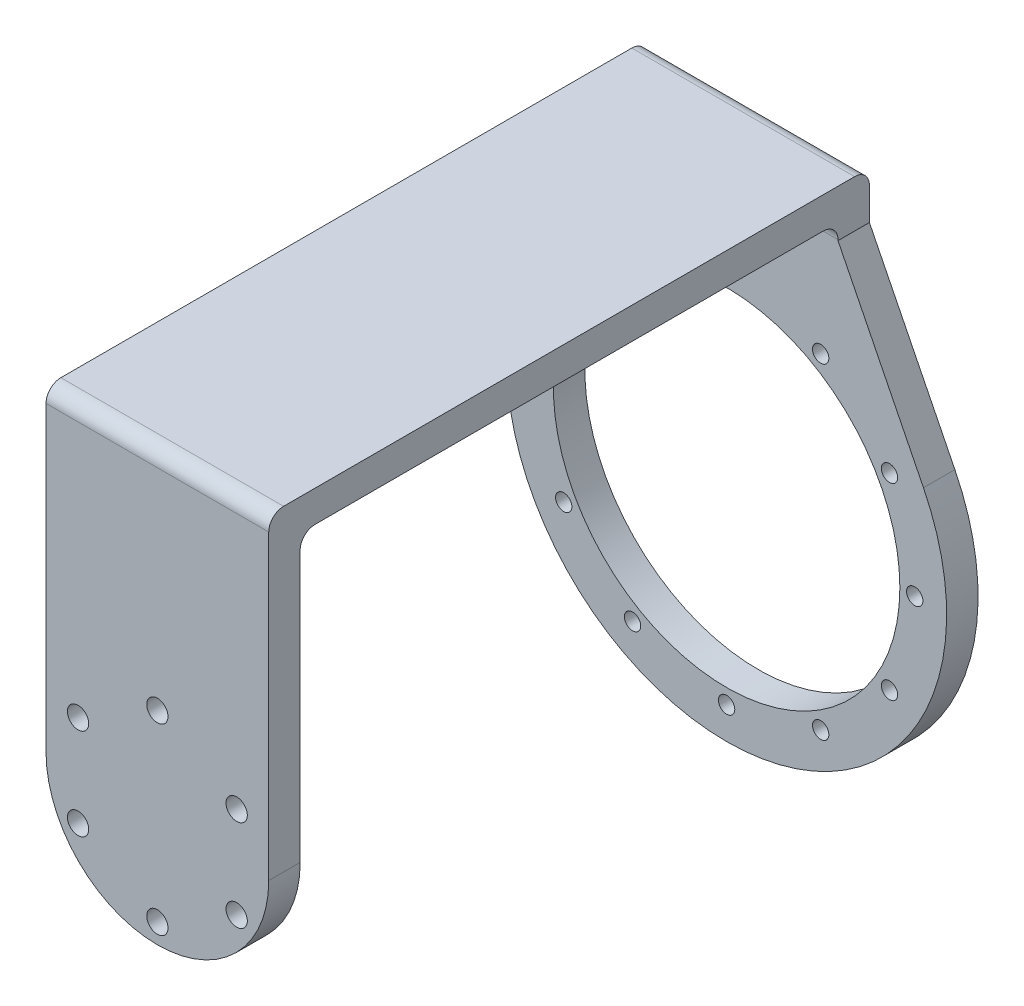
ISO-10303-21;
HEADER;
FILE_DESCRIPTION(('STEP AP214'),'2;1');
FILE_NAME('part.step','',(''),(''),'','','');
FILE_SCHEMA(('AUTOMOTIVE_DESIGN { 1 0 10303 214 1 1 1 1 }'));
ENDSEC;
DATA;
#1=APPLICATION_CONTEXT('core data for automotive mechanical design processes');
#2=APPLICATION_PROTOCOL_DEFINITION('international standard','automotive_design',2000,#1);
#3=PRODUCT_CONTEXT('',#1,'mechanical');
#4=PRODUCT('Part','Part','',(#3));
#5=PRODUCT_RELATED_PRODUCT_CATEGORY('part','',(#4));
#6=PRODUCT_DEFINITION_FORMATION('','',#4);
#7=PRODUCT_DEFINITION_CONTEXT('part definition',#1,'design');
#8=PRODUCT_DEFINITION('design','',#6,#7);
#9=PRODUCT_DEFINITION_SHAPE('','',#8);
#10=(LENGTH_UNIT() NAMED_UNIT(*) SI_UNIT(.MILLI.,.METRE.));
#11=(NAMED_UNIT(*) PLANE_ANGLE_UNIT() SI_UNIT($,.RADIAN.));
#12=(NAMED_UNIT(*) SI_UNIT($,.STERADIAN.) SOLID_ANGLE_UNIT());
#13=UNCERTAINTY_MEASURE_WITH_UNIT(LENGTH_MEASURE(1.E-05),#10,'distance_accuracy_value','');
#14=(GEOMETRIC_REPRESENTATION_CONTEXT(3) GLOBAL_UNCERTAINTY_ASSIGNED_CONTEXT((#13)) GLOBAL_UNIT_ASSIGNED_CONTEXT((#10,
#11,#12)) REPRESENTATION_CONTEXT('',''));
#15=CARTESIAN_POINT('',(0.,0.,0.));
#16=DIRECTION('',(0.,0.,1.));
#17=DIRECTION('',(1.,0.,0.));
#18=AXIS2_PLACEMENT_3D('',#15,#16,#17);
#19=CARTESIAN_POINT('',(0.,0.,6.35));
#20=DIRECTION('',(0.,0.,-1.));
#21=DIRECTION('',(-1.,0.,0.));
#22=AXIS2_PLACEMENT_3D('',#19,#20,#21);
#23=CYLINDRICAL_SURFACE('',#22,35.);
#24=CARTESIAN_POINT('',(0.,0.,6.35));
#25=DIRECTION('',(0.,0.,1.));
#26=DIRECTION('',(1.,0.,0.));
#27=AXIS2_PLACEMENT_3D('',#24,#25,#26);
#28=CIRCLE('',#27,35.);
#29=CARTESIAN_POINT('',(35.,0.,6.35));
#30=VERTEX_POINT('',#29);
#31=EDGE_CURVE('E51',#30,#30,#28,.T.);
#32=ORIENTED_EDGE('',*,*,#31,.T.);
#33=EDGE_LOOP('',(#32));
#34=FACE_BOUND('',#33,.T.);
#35=CARTESIAN_POINT('',(0.,0.,0.));
#36=DIRECTION('',(0.,0.,1.));
#37=DIRECTION('',(1.,0.,0.));
#38=AXIS2_PLACEMENT_3D('',#35,#36,#37);
#39=CIRCLE('',#38,35.);
#40=CARTESIAN_POINT('',(35.,0.,0.));
#41=VERTEX_POINT('',#40);
#42=EDGE_CURVE('E361',#41,#41,#39,.T.);
#43=ORIENTED_EDGE('',*,*,#42,.F.);
#44=EDGE_LOOP('',(#43));
#45=FACE_BOUND('',#44,.T.);
#46=ADVANCED_FACE('F43',(#34,#45),#23,.F.);
#47=CARTESIAN_POINT('',(0.,0.,6.35));
#48=DIRECTION('',(0.,0.,-1.));
#49=DIRECTION('',(-1.,0.,0.));
#50=AXIS2_PLACEMENT_3D('',#47,#48,#49);
#51=CYLINDRICAL_SURFACE('',#50,44.45);
#52=CARTESIAN_POINT('',(0.,0.,6.35));
#53=DIRECTION('',(0.,0.,1.));
#54=DIRECTION('',(1.,0.,0.));
#55=AXIS2_PLACEMENT_3D('',#52,#53,#54);
#56=CIRCLE('',#55,44.45);
#57=CARTESIAN_POINT('',(-39.770338523173,19.8525231079634,6.35));
#58=VERTEX_POINT('',#57);
#59=CARTESIAN_POINT('',(39.770338523173,19.8525231079634,6.35));
#60=VERTEX_POINT('',#59);
#61=EDGE_CURVE('E11',#58,#60,#56,.T.);
#62=ORIENTED_EDGE('',*,*,#61,.F.);
#63=DIRECTION('',(0.,0.,-1.));
#64=VECTOR('',#63,1.);
#65=CARTESIAN_POINT('',(-39.770338523173,19.8525231079634,6.35));
#66=LINE('',#65,#64);
#67=CARTESIAN_POINT('',(-39.770338523173,19.8525231079634,0.));
#68=VERTEX_POINT('',#67);
#69=EDGE_CURVE('E281',#58,#68,#66,.T.);
#70=ORIENTED_EDGE('',*,*,#69,.T.);
#71=CARTESIAN_POINT('',(0.,0.,0.));
#72=DIRECTION('',(0.,0.,1.));
#73=DIRECTION('',(1.,0.,0.));
#74=AXIS2_PLACEMENT_3D('',#71,#72,#73);
#75=CIRCLE('',#74,44.45);
#76=CARTESIAN_POINT('',(39.770338523173,19.8525231079634,0.));
#77=VERTEX_POINT('',#76);
#78=EDGE_CURVE('E46',#68,#77,#75,.T.);
#79=ORIENTED_EDGE('',*,*,#78,.T.);
#80=DIRECTION('',(0.,0.,-1.));
#81=VECTOR('',#80,1.);
#82=CARTESIAN_POINT('',(39.770338523173,19.8525231079634,6.35));
#83=LINE('',#82,#81);
#84=EDGE_CURVE('E62',#60,#77,#83,.T.);
#85=ORIENTED_EDGE('',*,*,#84,.F.);
#86=EDGE_LOOP('',(#62,#70,#79,#85));
#87=FACE_BOUND('',#86,.T.);
#88=ADVANCED_FACE('F366',(#87),#51,.T.);
#89=CARTESIAN_POINT('',(0.,0.,6.35));
#90=DIRECTION('',(0.,0.,1.));
#91=DIRECTION('',(1.,0.,0.));
#92=AXIS2_PLACEMENT_3D('',#89,#90,#91);
#93=PLANE('',#92);
#94=CARTESIAN_POINT('',(18.9999999999996,32.9089653438089,6.35));
#95=DIRECTION('',(0.,0.,1.));
#96=DIRECTION('',(1.,0.,0.));
#97=AXIS2_PLACEMENT_3D('',#94,#95,#96);
#98=CIRCLE('',#97,1.64999999999999);
#99=CARTESIAN_POINT('',(20.6499999999996,32.9089653438089,6.35));
#100=VERTEX_POINT('',#99);
#101=EDGE_CURVE('E283',#100,#100,#98,.T.);
#102=ORIENTED_EDGE('',*,*,#101,.F.);
#103=EDGE_LOOP('',(#102));
#104=FACE_BOUND('',#103,.T.);
#105=CARTESIAN_POINT('',(32.9089653438084,19.0000000000004,6.35));
#106=DIRECTION('',(0.,0.,1.));
#107=DIRECTION('',(1.,0.,0.));
#108=AXIS2_PLACEMENT_3D('',#105,#106,#107);
#109=CIRCLE('',#108,1.64999999999998);
#110=CARTESIAN_POINT('',(34.5589653438084,19.0000000000004,6.35));
#111=VERTEX_POINT('',#110);
#112=EDGE_CURVE('E295',#111,#111,#109,.T.);
#113=ORIENTED_EDGE('',*,*,#112,.F.);
#114=EDGE_LOOP('',(#113));
#115=FACE_BOUND('',#114,.T.);
#116=CARTESIAN_POINT('',(38.,3.98028872628117E-13,6.35));
#117=DIRECTION('',(0.,0.,1.));
#118=DIRECTION('',(1.,0.,0.));
#119=AXIS2_PLACEMENT_3D('',#116,#117,#118);
#120=CIRCLE('',#119,1.64999999999998);
#121=CARTESIAN_POINT('',(39.65,3.98028872628117E-13,6.35));
#122=VERTEX_POINT('',#121);
#123=EDGE_CURVE('E301',#122,#122,#120,.T.);
#124=ORIENTED_EDGE('',*,*,#123,.F.);
#125=EDGE_LOOP('',(#124));
#126=FACE_BOUND('',#125,.T.);
#127=CARTESIAN_POINT('',(32.9089653438088,-18.9999999999997,6.35));
#128=DIRECTION('',(0.,0.,1.));
#129=DIRECTION('',(1.,0.,0.));
#130=AXIS2_PLACEMENT_3D('',#127,#128,#129);
#131=CIRCLE('',#130,1.64999999999999);
#132=CARTESIAN_POINT('',(34.5589653438088,-18.9999999999997,6.35));
#133=VERTEX_POINT('',#132);
#134=EDGE_CURVE('E307',#133,#133,#131,.T.);
#135=ORIENTED_EDGE('',*,*,#134,.F.);
#136=EDGE_LOOP('',(#135));
#137=FACE_BOUND('',#136,.T.);
#138=CARTESIAN_POINT('',(19.0000000000003,-32.9089653438085,6.35));
#139=DIRECTION('',(0.,0.,1.));
#140=DIRECTION('',(1.,0.,0.));
#141=AXIS2_PLACEMENT_3D('',#138,#139,#140);
#142=CIRCLE('',#141,1.64999999999999);
#143=CARTESIAN_POINT('',(20.6500000000003,-32.9089653438085,6.35));
#144=VERTEX_POINT('',#143);
#145=EDGE_CURVE('E313',#144,#144,#142,.T.);
#146=ORIENTED_EDGE('',*,*,#145,.F.);
#147=EDGE_LOOP('',(#146));
#148=FACE_BOUND('',#147,.T.);
#149=CARTESIAN_POINT('',(0.,-38.,6.35));
#150=DIRECTION('',(0.,0.,1.));
#151=DIRECTION('',(1.,0.,0.));
#152=AXIS2_PLACEMENT_3D('',#149,#150,#151);
#153=CIRCLE('',#152,1.64999999999999);
#154=CARTESIAN_POINT('',(1.64999999999999,-38.,6.35));
#155=VERTEX_POINT('',#154);
#156=EDGE_CURVE('E319',#155,#155,#153,.T.);
#157=ORIENTED_EDGE('',*,*,#156,.F.);
#158=EDGE_LOOP('',(#157));
#159=FACE_BOUND('',#158,.T.);
#160=CARTESIAN_POINT('',(-18.9999999999998,-32.9089653438088,6.35));
#161=DIRECTION('',(0.,0.,1.));
#162=DIRECTION('',(1.,0.,0.));
#163=AXIS2_PLACEMENT_3D('',#160,#161,#162);
#164=CIRCLE('',#163,1.64999999999999);
#165=CARTESIAN_POINT('',(-17.3499999999998,-32.9089653438088,6.35));
#166=VERTEX_POINT('',#165);
#167=EDGE_CURVE('E325',#166,#166,#164,.T.);
#168=ORIENTED_EDGE('',*,*,#167,.F.);
#169=EDGE_LOOP('',(#168));
#170=FACE_BOUND('',#169,.T.);
#171=CARTESIAN_POINT('',(-32.9089653438086,-19.0000000000002,6.35));
#172=DIRECTION('',(0.,0.,1.));
#173=DIRECTION('',(1.,0.,0.));
#174=AXIS2_PLACEMENT_3D('',#171,#172,#173);
#175=CIRCLE('',#174,1.64999999999998);
#176=CARTESIAN_POINT('',(-31.2589653438086,-19.0000000000002,6.35));
#177=VERTEX_POINT('',#176);
#178=EDGE_CURVE('E331',#177,#177,#175,.T.);
#179=ORIENTED_EDGE('',*,*,#178,.F.);
#180=EDGE_LOOP('',(#179));
#181=FACE_BOUND('',#180,.T.);
#182=CARTESIAN_POINT('',(-38.,-1.32676290876039E-13,6.35));
#183=DIRECTION('',(0.,0.,1.));
#184=DIRECTION('',(1.,0.,0.));
#185=AXIS2_PLACEMENT_3D('',#182,#183,#184);
#186=CIRCLE('',#185,1.64999999999998);
#187=CARTESIAN_POINT('',(-36.35,-1.32676290876039E-13,6.35));
#188=VERTEX_POINT('',#187);
#189=EDGE_CURVE('E337',#188,#188,#186,.T.);
#190=ORIENTED_EDGE('',*,*,#189,.F.);
#191=EDGE_LOOP('',(#190));
#192=FACE_BOUND('',#191,.T.);
#193=CARTESIAN_POINT('',(-32.9089653438087,18.9999999999999,6.35));
#194=DIRECTION('',(0.,0.,1.));
#195=DIRECTION('',(1.,0.,0.));
#196=AXIS2_PLACEMENT_3D('',#193,#194,#195);
#197=CIRCLE('',#196,1.64999999999999);
#198=CARTESIAN_POINT('',(-31.2589653438087,18.9999999999999,6.35));
#199=VERTEX_POINT('',#198);
#200=EDGE_CURVE('E343',#199,#199,#197,.T.);
#201=ORIENTED_EDGE('',*,*,#200,.F.);
#202=EDGE_LOOP('',(#201));
#203=FACE_BOUND('',#202,.T.);
#204=CARTESIAN_POINT('',(-19.,32.9089653438086,6.35));
#205=DIRECTION('',(0.,0.,1.));
#206=DIRECTION('',(1.,0.,0.));
#207=AXIS2_PLACEMENT_3D('',#204,#205,#206);
#208=CIRCLE('',#207,1.64999999999999);
#209=CARTESIAN_POINT('',(-17.35,32.9089653438086,6.35));
#210=VERTEX_POINT('',#209);
#211=EDGE_CURVE('E349',#210,#210,#208,.T.);
#212=ORIENTED_EDGE('',*,*,#211,.F.);
#213=EDGE_LOOP('',(#212));
#214=FACE_BOUND('',#213,.T.);
#215=CARTESIAN_POINT('',(0.,38.,6.35));
#216=DIRECTION('',(0.,0.,1.));
#217=DIRECTION('',(1.,0.,0.));
#218=AXIS2_PLACEMENT_3D('',#215,#216,#217);
#219=CIRCLE('',#218,1.64999999999999);
#220=CARTESIAN_POINT('',(1.64999999999999,38.,6.35));
#221=VERTEX_POINT('',#220);
#222=EDGE_CURVE('E355',#221,#221,#219,.T.);
#223=ORIENTED_EDGE('',*,*,#222,.F.);
#224=EDGE_LOOP('',(#223));
#225=FACE_BOUND('',#224,.T.);
#226=ORIENTED_EDGE('',*,*,#31,.F.);
#227=EDGE_LOOP('',(#226));
#228=FACE_BOUND('',#227,.T.);
#229=ORIENTED_EDGE('',*,*,#61,.T.);
#230=DIRECTION('',(0.446625941686466,-0.894720776674308,0.));
#231=VECTOR('',#230,1.);
#232=CARTESIAN_POINT('',(22.5,54.45,6.35));
#233=LINE('',#232,#231);
#234=CARTESIAN_POINT('',(22.5,54.45,6.35));
#235=VERTEX_POINT('',#234);
#236=EDGE_CURVE('E272',#235,#60,#233,.T.);
#237=ORIENTED_EDGE('',*,*,#236,.F.);
#238=DIRECTION('',(0.,-1.,0.));
#239=VECTOR('',#238,1.);
#240=CARTESIAN_POINT('',(22.5,54.625,6.35));
#241=LINE('',#240,#239);
#242=CARTESIAN_POINT('',(22.5,54.625,6.35));
#243=VERTEX_POINT('',#242);
#244=EDGE_CURVE('E250',#243,#235,#241,.T.);
#245=ORIENTED_EDGE('',*,*,#244,.F.);
#246=DIRECTION('',(-1.,0.,0.));
#247=VECTOR('',#246,1.);
#248=CARTESIAN_POINT('',(22.5,54.625,6.35));
#249=LINE('',#248,#247);
#250=CARTESIAN_POINT('',(-22.5,54.625,6.35));
#251=VERTEX_POINT('',#250);
#252=EDGE_CURVE('E252',#243,#251,#249,.T.);
#253=ORIENTED_EDGE('',*,*,#252,.T.);
#254=DIRECTION('',(0.,-1.,0.));
#255=VECTOR('',#254,1.);
#256=CARTESIAN_POINT('',(-22.5,54.625,6.35));
#257=LINE('',#256,#255);
#258=CARTESIAN_POINT('',(-22.5,54.45,6.35));
#259=VERTEX_POINT('',#258);
#260=EDGE_CURVE('E230',#251,#259,#257,.T.);
#261=ORIENTED_EDGE('',*,*,#260,.T.);
#262=DIRECTION('',(0.446625941686466,0.894720776674308,0.));
#263=VECTOR('',#262,1.);
#264=CARTESIAN_POINT('',(-39.770338523173,19.8525231079634,6.35));
#265=LINE('',#264,#263);
#266=EDGE_CURVE('E269',#58,#259,#265,.T.);
#267=ORIENTED_EDGE('',*,*,#266,.F.);
#268=EDGE_LOOP('',(#229,#237,#245,#253,#261,#267));
#269=FACE_BOUND('',#268,.T.);
#270=ADVANCED_FACE('F381',(#104,#115,#126,#137,#148,#159,#170,#181,#192,#203,#214,#225,#228,
#269),#93,.T.);
#271=CARTESIAN_POINT('',(0.,0.,0.));
#272=DIRECTION('',(0.,0.,1.));
#273=DIRECTION('',(1.,0.,0.));
#274=AXIS2_PLACEMENT_3D('',#271,#272,#273);
#275=PLANE('',#274);
#276=CARTESIAN_POINT('',(18.9999999999996,32.9089653438089,0.));
#277=DIRECTION('',(0.,0.,1.));
#278=DIRECTION('',(1.,0.,0.));
#279=AXIS2_PLACEMENT_3D('',#276,#277,#278);
#280=CIRCLE('',#279,1.64999999999999);
#281=CARTESIAN_POINT('',(20.6499999999996,32.9089653438089,0.));
#282=VERTEX_POINT('',#281);
#283=EDGE_CURVE('E292',#282,#282,#280,.T.);
#284=ORIENTED_EDGE('',*,*,#283,.T.);
#285=EDGE_LOOP('',(#284));
#286=FACE_BOUND('',#285,.T.);
#287=CARTESIAN_POINT('',(32.9089653438084,19.0000000000004,0.));
#288=DIRECTION('',(0.,0.,1.));
#289=DIRECTION('',(1.,0.,0.));
#290=AXIS2_PLACEMENT_3D('',#287,#288,#289);
#291=CIRCLE('',#290,1.64999999999998);
#292=CARTESIAN_POINT('',(34.5589653438084,19.0000000000004,0.));
#293=VERTEX_POINT('',#292);
#294=EDGE_CURVE('E298',#293,#293,#291,.T.);
#295=ORIENTED_EDGE('',*,*,#294,.T.);
#296=EDGE_LOOP('',(#295));
#297=FACE_BOUND('',#296,.T.);
#298=CARTESIAN_POINT('',(38.,3.98028872628117E-13,0.));
#299=DIRECTION('',(0.,0.,1.));
#300=DIRECTION('',(1.,0.,0.));
#301=AXIS2_PLACEMENT_3D('',#298,#299,#300);
#302=CIRCLE('',#301,1.64999999999998);
#303=CARTESIAN_POINT('',(39.65,3.98028872628117E-13,0.));
#304=VERTEX_POINT('',#303);
#305=EDGE_CURVE('E304',#304,#304,#302,.T.);
#306=ORIENTED_EDGE('',*,*,#305,.T.);
#307=EDGE_LOOP('',(#306));
#308=FACE_BOUND('',#307,.T.);
#309=CARTESIAN_POINT('',(32.9089653438088,-18.9999999999997,0.));
#310=DIRECTION('',(0.,0.,1.));
#311=DIRECTION('',(1.,0.,0.));
#312=AXIS2_PLACEMENT_3D('',#309,#310,#311);
#313=CIRCLE('',#312,1.64999999999998);
#314=CARTESIAN_POINT('',(34.5589653438088,-18.9999999999997,0.));
#315=VERTEX_POINT('',#314);
#316=EDGE_CURVE('E310',#315,#315,#313,.T.);
#317=ORIENTED_EDGE('',*,*,#316,.T.);
#318=EDGE_LOOP('',(#317));
#319=FACE_BOUND('',#318,.T.);
#320=CARTESIAN_POINT('',(19.0000000000003,-32.9089653438085,0.));
#321=DIRECTION('',(0.,0.,1.));
#322=DIRECTION('',(1.,0.,0.));
#323=AXIS2_PLACEMENT_3D('',#320,#321,#322);
#324=CIRCLE('',#323,1.64999999999999);
#325=CARTESIAN_POINT('',(20.6500000000003,-32.9089653438085,0.));
#326=VERTEX_POINT('',#325);
#327=EDGE_CURVE('E316',#326,#326,#324,.T.);
#328=ORIENTED_EDGE('',*,*,#327,.T.);
#329=EDGE_LOOP('',(#328));
#330=FACE_BOUND('',#329,.T.);
#331=CARTESIAN_POINT('',(0.,-38.,0.));
#332=DIRECTION('',(0.,0.,1.));
#333=DIRECTION('',(1.,0.,0.));
#334=AXIS2_PLACEMENT_3D('',#331,#332,#333);
#335=CIRCLE('',#334,1.64999999999999);
#336=CARTESIAN_POINT('',(1.64999999999999,-38.,0.));
#337=VERTEX_POINT('',#336);
#338=EDGE_CURVE('E322',#337,#337,#335,.T.);
#339=ORIENTED_EDGE('',*,*,#338,.T.);
#340=EDGE_LOOP('',(#339));
#341=FACE_BOUND('',#340,.T.);
#342=CARTESIAN_POINT('',(-18.9999999999998,-32.9089653438088,0.));
#343=DIRECTION('',(0.,0.,1.));
#344=DIRECTION('',(1.,0.,0.));
#345=AXIS2_PLACEMENT_3D('',#342,#343,#344);
#346=CIRCLE('',#345,1.64999999999999);
#347=CARTESIAN_POINT('',(-17.3499999999998,-32.9089653438088,0.));
#348=VERTEX_POINT('',#347);
#349=EDGE_CURVE('E328',#348,#348,#346,.T.);
#350=ORIENTED_EDGE('',*,*,#349,.T.);
#351=EDGE_LOOP('',(#350));
#352=FACE_BOUND('',#351,.T.);
#353=CARTESIAN_POINT('',(-32.9089653438086,-19.0000000000002,0.));
#354=DIRECTION('',(0.,0.,1.));
#355=DIRECTION('',(1.,0.,0.));
#356=AXIS2_PLACEMENT_3D('',#353,#354,#355);
#357=CIRCLE('',#356,1.64999999999998);
#358=CARTESIAN_POINT('',(-31.2589653438086,-19.0000000000002,0.));
#359=VERTEX_POINT('',#358);
#360=EDGE_CURVE('E334',#359,#359,#357,.T.);
#361=ORIENTED_EDGE('',*,*,#360,.T.);
#362=EDGE_LOOP('',(#361));
#363=FACE_BOUND('',#362,.T.);
#364=CARTESIAN_POINT('',(-38.,-1.32676290876039E-13,0.));
#365=DIRECTION('',(0.,0.,1.));
#366=DIRECTION('',(1.,0.,0.));
#367=AXIS2_PLACEMENT_3D('',#364,#365,#366);
#368=CIRCLE('',#367,1.64999999999998);
#369=CARTESIAN_POINT('',(-36.35,-1.32676290876039E-13,0.));
#370=VERTEX_POINT('',#369);
#371=EDGE_CURVE('E340',#370,#370,#368,.T.);
#372=ORIENTED_EDGE('',*,*,#371,.T.);
#373=EDGE_LOOP('',(#372));
#374=FACE_BOUND('',#373,.T.);
#375=CARTESIAN_POINT('',(-32.9089653438087,18.9999999999999,0.));
#376=DIRECTION('',(0.,0.,1.));
#377=DIRECTION('',(1.,0.,0.));
#378=AXIS2_PLACEMENT_3D('',#375,#376,#377);
#379=CIRCLE('',#378,1.64999999999998);
#380=CARTESIAN_POINT('',(-31.2589653438087,18.9999999999999,0.));
#381=VERTEX_POINT('',#380);
#382=EDGE_CURVE('E346',#381,#381,#379,.T.);
#383=ORIENTED_EDGE('',*,*,#382,.T.);
#384=EDGE_LOOP('',(#383));
#385=FACE_BOUND('',#384,.T.);
#386=CARTESIAN_POINT('',(-19.,32.9089653438086,0.));
#387=DIRECTION('',(0.,0.,1.));
#388=DIRECTION('',(1.,0.,0.));
#389=AXIS2_PLACEMENT_3D('',#386,#387,#388);
#390=CIRCLE('',#389,1.64999999999999);
#391=CARTESIAN_POINT('',(-17.35,32.9089653438086,0.));
#392=VERTEX_POINT('',#391);
#393=EDGE_CURVE('E352',#392,#392,#390,.T.);
#394=ORIENTED_EDGE('',*,*,#393,.T.);
#395=EDGE_LOOP('',(#394));
#396=FACE_BOUND('',#395,.T.);
#397=CARTESIAN_POINT('',(0.,38.,0.));
#398=DIRECTION('',(0.,0.,1.));
#399=DIRECTION('',(1.,0.,0.));
#400=AXIS2_PLACEMENT_3D('',#397,#398,#399);
#401=CIRCLE('',#400,1.64999999999999);
#402=CARTESIAN_POINT('',(1.64999999999999,38.,0.));
#403=VERTEX_POINT('',#402);
#404=EDGE_CURVE('E358',#403,#403,#401,.T.);
#405=ORIENTED_EDGE('',*,*,#404,.T.);
#406=EDGE_LOOP('',(#405));
#407=FACE_BOUND('',#406,.T.);
#408=ORIENTED_EDGE('',*,*,#42,.T.);
#409=EDGE_LOOP('',(#408));
#410=FACE_BOUND('',#409,.T.);
#411=ORIENTED_EDGE('',*,*,#78,.F.);
#412=DIRECTION('',(0.446625941686466,0.894720776674308,0.));
#413=VECTOR('',#412,1.);
#414=CARTESIAN_POINT('',(-39.770338523173,19.8525231079634,0.));
#415=LINE('',#414,#413);
#416=CARTESIAN_POINT('',(-22.5,54.45,0.));
#417=VERTEX_POINT('',#416);
#418=EDGE_CURVE('E268',#68,#417,#415,.T.);
#419=ORIENTED_EDGE('',*,*,#418,.T.);
#420=DIRECTION('',(0.,1.,0.));
#421=VECTOR('',#420,1.);
#422=CARTESIAN_POINT('',(-22.5,54.45,0.));
#423=LINE('',#422,#421);
#424=CARTESIAN_POINT('',(-22.5,60.975,0.));
#425=VERTEX_POINT('',#424);
#426=EDGE_CURVE('E196',#417,#425,#423,.T.);
#427=ORIENTED_EDGE('',*,*,#426,.T.);
#428=DIRECTION('',(-1.,0.,0.));
#429=VECTOR('',#428,1.);
#430=CARTESIAN_POINT('',(22.5,60.975,0.));
#431=LINE('',#430,#429);
#432=CARTESIAN_POINT('',(22.5,60.975,0.));
#433=VERTEX_POINT('',#432);
#434=EDGE_CURVE('E266',#433,#425,#431,.T.);
#435=ORIENTED_EDGE('',*,*,#434,.F.);
#436=DIRECTION('',(0.,1.,0.));
#437=VECTOR('',#436,1.);
#438=CARTESIAN_POINT('',(22.5,54.45,0.));
#439=LINE('',#438,#437);
#440=CARTESIAN_POINT('',(22.5,54.45,0.));
#441=VERTEX_POINT('',#440);
#442=EDGE_CURVE('E233',#441,#433,#439,.T.);
#443=ORIENTED_EDGE('',*,*,#442,.F.);
#444=DIRECTION('',(0.446625941686466,-0.894720776674308,0.));
#445=VECTOR('',#444,1.);
#446=CARTESIAN_POINT('',(22.5,54.45,0.));
#447=LINE('',#446,#445);
#448=EDGE_CURVE('E273',#441,#77,#447,.T.);
#449=ORIENTED_EDGE('',*,*,#448,.T.);
#450=EDGE_LOOP('',(#411,#419,#427,#435,#443,#449));
#451=FACE_BOUND('',#450,.T.);
#452=ADVANCED_FACE('F374',(#286,#297,#308,#319,#330,#341,#352,#363,#374,#385,#396,#407,#410,
#451),#275,.F.);
#453=CARTESIAN_POINT('',(0.,38.,6.35));
#454=DIRECTION('',(0.,0.,1.));
#455=DIRECTION('',(1.,0.,0.));
#456=AXIS2_PLACEMENT_3D('',#453,#454,#455);
#457=CYLINDRICAL_SURFACE('',#456,1.64999999999999);
#458=ORIENTED_EDGE('',*,*,#404,.F.);
#459=EDGE_LOOP('',(#458));
#460=FACE_BOUND('',#459,.T.);
#461=ORIENTED_EDGE('',*,*,#222,.T.);
#462=EDGE_LOOP('',(#461));
#463=FACE_BOUND('',#462,.T.);
#464=ADVANCED_FACE('F439',(#460,#463),#457,.F.);
#465=CARTESIAN_POINT('',(-19.,32.9089653438086,6.35));
#466=DIRECTION('',(0.,0.,1.));
#467=DIRECTION('',(1.,0.,0.));
#468=AXIS2_PLACEMENT_3D('',#465,#466,#467);
#469=CYLINDRICAL_SURFACE('',#468,1.64999999999999);
#470=ORIENTED_EDGE('',*,*,#393,.F.);
#471=EDGE_LOOP('',(#470));
#472=FACE_BOUND('',#471,.T.);
#473=ORIENTED_EDGE('',*,*,#211,.T.);
#474=EDGE_LOOP('',(#473));
#475=FACE_BOUND('',#474,.T.);
#476=ADVANCED_FACE('F447',(#472,#475),#469,.F.);
#477=CARTESIAN_POINT('',(-32.9089653438087,18.9999999999999,6.35));
#478=DIRECTION('',(0.,0.,1.));
#479=DIRECTION('',(1.,0.,0.));
#480=AXIS2_PLACEMENT_3D('',#477,#478,#479);
#481=CYLINDRICAL_SURFACE('',#480,1.64999999999999);
#482=ORIENTED_EDGE('',*,*,#382,.F.);
#483=EDGE_LOOP('',(#482));
#484=FACE_BOUND('',#483,.T.);
#485=ORIENTED_EDGE('',*,*,#200,.T.);
#486=EDGE_LOOP('',(#485));
#487=FACE_BOUND('',#486,.T.);
#488=ADVANCED_FACE('F451',(#484,#487),#481,.F.);
#489=CARTESIAN_POINT('',(-38.,-1.32676290876039E-13,6.35));
#490=DIRECTION('',(0.,0.,1.));
#491=DIRECTION('',(1.,0.,0.));
#492=AXIS2_PLACEMENT_3D('',#489,#490,#491);
#493=CYLINDRICAL_SURFACE('',#492,1.64999999999998);
#494=ORIENTED_EDGE('',*,*,#371,.F.);
#495=EDGE_LOOP('',(#494));
#496=FACE_BOUND('',#495,.T.);
#497=ORIENTED_EDGE('',*,*,#189,.T.);
#498=EDGE_LOOP('',(#497));
#499=FACE_BOUND('',#498,.T.);
#500=ADVANCED_FACE('F455',(#496,#499),#493,.F.);
#501=CARTESIAN_POINT('',(-32.9089653438086,-19.0000000000002,6.35));
#502=DIRECTION('',(0.,0.,1.));
#503=DIRECTION('',(1.,0.,0.));
#504=AXIS2_PLACEMENT_3D('',#501,#502,#503);
#505=CYLINDRICAL_SURFACE('',#504,1.64999999999998);
#506=ORIENTED_EDGE('',*,*,#360,.F.);
#507=EDGE_LOOP('',(#506));
#508=FACE_BOUND('',#507,.T.);
#509=ORIENTED_EDGE('',*,*,#178,.T.);
#510=EDGE_LOOP('',(#509));
#511=FACE_BOUND('',#510,.T.);
#512=ADVANCED_FACE('F459',(#508,#511),#505,.F.);
#513=CARTESIAN_POINT('',(-18.9999999999998,-32.9089653438088,6.35));
#514=DIRECTION('',(0.,0.,1.));
#515=DIRECTION('',(1.,0.,0.));
#516=AXIS2_PLACEMENT_3D('',#513,#514,#515);
#517=CYLINDRICAL_SURFACE('',#516,1.64999999999999);
#518=ORIENTED_EDGE('',*,*,#349,.F.);
#519=EDGE_LOOP('',(#518));
#520=FACE_BOUND('',#519,.T.);
#521=ORIENTED_EDGE('',*,*,#167,.T.);
#522=EDGE_LOOP('',(#521));
#523=FACE_BOUND('',#522,.T.);
#524=ADVANCED_FACE('F463',(#520,#523),#517,.F.);
#525=CARTESIAN_POINT('',(0.,-38.,6.35));
#526=DIRECTION('',(0.,0.,1.));
#527=DIRECTION('',(1.,0.,0.));
#528=AXIS2_PLACEMENT_3D('',#525,#526,#527);
#529=CYLINDRICAL_SURFACE('',#528,1.64999999999999);
#530=ORIENTED_EDGE('',*,*,#338,.F.);
#531=EDGE_LOOP('',(#530));
#532=FACE_BOUND('',#531,.T.);
#533=ORIENTED_EDGE('',*,*,#156,.T.);
#534=EDGE_LOOP('',(#533));
#535=FACE_BOUND('',#534,.T.);
#536=ADVANCED_FACE('F467',(#532,#535),#529,.F.);
#537=CARTESIAN_POINT('',(19.0000000000003,-32.9089653438085,6.35));
#538=DIRECTION('',(0.,0.,1.));
#539=DIRECTION('',(1.,0.,0.));
#540=AXIS2_PLACEMENT_3D('',#537,#538,#539);
#541=CYLINDRICAL_SURFACE('',#540,1.64999999999999);
#542=ORIENTED_EDGE('',*,*,#327,.F.);
#543=EDGE_LOOP('',(#542));
#544=FACE_BOUND('',#543,.T.);
#545=ORIENTED_EDGE('',*,*,#145,.T.);
#546=EDGE_LOOP('',(#545));
#547=FACE_BOUND('',#546,.T.);
#548=ADVANCED_FACE('F471',(#544,#547),#541,.F.);
#549=CARTESIAN_POINT('',(32.9089653438088,-18.9999999999997,6.35));
#550=DIRECTION('',(0.,0.,1.));
#551=DIRECTION('',(1.,0.,0.));
#552=AXIS2_PLACEMENT_3D('',#549,#550,#551);
#553=CYLINDRICAL_SURFACE('',#552,1.64999999999999);
#554=ORIENTED_EDGE('',*,*,#316,.F.);
#555=EDGE_LOOP('',(#554));
#556=FACE_BOUND('',#555,.T.);
#557=ORIENTED_EDGE('',*,*,#134,.T.);
#558=EDGE_LOOP('',(#557));
#559=FACE_BOUND('',#558,.T.);
#560=ADVANCED_FACE('F475',(#556,#559),#553,.F.);
#561=CARTESIAN_POINT('',(38.,3.98028872628117E-13,6.35));
#562=DIRECTION('',(0.,0.,1.));
#563=DIRECTION('',(1.,0.,0.));
#564=AXIS2_PLACEMENT_3D('',#561,#562,#563);
#565=CYLINDRICAL_SURFACE('',#564,1.64999999999998);
#566=ORIENTED_EDGE('',*,*,#305,.F.);
#567=EDGE_LOOP('',(#566));
#568=FACE_BOUND('',#567,.T.);
#569=ORIENTED_EDGE('',*,*,#123,.T.);
#570=EDGE_LOOP('',(#569));
#571=FACE_BOUND('',#570,.T.);
#572=ADVANCED_FACE('F479',(#568,#571),#565,.F.);
#573=CARTESIAN_POINT('',(32.9089653438084,19.0000000000004,6.35));
#574=DIRECTION('',(0.,0.,1.));
#575=DIRECTION('',(1.,0.,0.));
#576=AXIS2_PLACEMENT_3D('',#573,#574,#575);
#577=CYLINDRICAL_SURFACE('',#576,1.64999999999998);
#578=ORIENTED_EDGE('',*,*,#294,.F.);
#579=EDGE_LOOP('',(#578));
#580=FACE_BOUND('',#579,.T.);
#581=ORIENTED_EDGE('',*,*,#112,.T.);
#582=EDGE_LOOP('',(#581));
#583=FACE_BOUND('',#582,.T.);
#584=ADVANCED_FACE('F483',(#580,#583),#577,.F.);
#585=CARTESIAN_POINT('',(18.9999999999996,32.9089653438089,6.35));
#586=DIRECTION('',(0.,0.,1.));
#587=DIRECTION('',(1.,0.,0.));
#588=AXIS2_PLACEMENT_3D('',#585,#586,#587);
#589=CYLINDRICAL_SURFACE('',#588,1.64999999999999);
#590=ORIENTED_EDGE('',*,*,#283,.F.);
#591=EDGE_LOOP('',(#590));
#592=FACE_BOUND('',#591,.T.);
#593=ORIENTED_EDGE('',*,*,#101,.T.);
#594=EDGE_LOOP('',(#593));
#595=FACE_BOUND('',#594,.T.);
#596=ADVANCED_FACE('F487',(#592,#595),#589,.F.);
#597=CARTESIAN_POINT('',(-39.770338523173,19.8525231079634,6.35));
#598=DIRECTION('',(-0.894720776674308,0.446625941686466,0.));
#599=DIRECTION('',(-0.446625941686466,-0.894720776674308,0.));
#600=AXIS2_PLACEMENT_3D('',#597,#598,#599);
#601=PLANE('',#600);
#602=ORIENTED_EDGE('',*,*,#418,.F.);
#603=ORIENTED_EDGE('',*,*,#69,.F.);
#604=ORIENTED_EDGE('',*,*,#266,.T.);
#605=DIRECTION('',(0.,0.,-1.));
#606=VECTOR('',#605,1.);
#607=CARTESIAN_POINT('',(-22.5,54.45,6.35));
#608=LINE('',#607,#606);
#609=EDGE_CURVE('E276',#259,#417,#608,.T.);
#610=ORIENTED_EDGE('',*,*,#609,.T.);
#611=EDGE_LOOP('',(#602,#603,#604,#610));
#612=FACE_BOUND('',#611,.T.);
#613=ADVANCED_FACE('F385',(#612),#601,.T.);
#614=CARTESIAN_POINT('',(22.5,54.45,6.35));
#615=DIRECTION('',(0.894720776674308,0.446625941686466,0.));
#616=DIRECTION('',(-0.446625941686466,0.894720776674308,0.));
#617=AXIS2_PLACEMENT_3D('',#614,#615,#616);
#618=PLANE('',#617);
#619=ORIENTED_EDGE('',*,*,#448,.F.);
#620=DIRECTION('',(0.,0.,-1.));
#621=VECTOR('',#620,1.);
#622=CARTESIAN_POINT('',(22.5,54.45,6.35));
#623=LINE('',#622,#621);
#624=EDGE_CURVE('E285',#235,#441,#623,.T.);
#625=ORIENTED_EDGE('',*,*,#624,.F.);
#626=ORIENTED_EDGE('',*,*,#236,.T.);
#627=ORIENTED_EDGE('',*,*,#84,.T.);
#628=EDGE_LOOP('',(#619,#625,#626,#627));
#629=FACE_BOUND('',#628,.T.);
#630=ADVANCED_FACE('F371',(#629),#618,.T.);
#631=CARTESIAN_POINT('',(22.5,60.975,3.));
#632=DIRECTION('',(-1.,0.,0.));
#633=DIRECTION('',(0.,0.,1.));
#634=AXIS2_PLACEMENT_3D('',#631,#632,#633);
#635=CYLINDRICAL_SURFACE('',#634,3.);
#636=ORIENTED_EDGE('',*,*,#434,.T.);
#637=CARTESIAN_POINT('',(-22.5,60.975,3.));
#638=DIRECTION('',(1.,0.,0.));
#639=DIRECTION('',(0.,0.,-1.));
#640=AXIS2_PLACEMENT_3D('',#637,#638,#639);
#641=CIRCLE('',#640,3.);
#642=CARTESIAN_POINT('',(-22.5,63.975,3.00000000000002));
#643=VERTEX_POINT('',#642);
#644=EDGE_CURVE('E213',#425,#643,#641,.T.);
#645=ORIENTED_EDGE('',*,*,#644,.T.);
#646=DIRECTION('',(-1.,0.,0.));
#647=VECTOR('',#646,1.);
#648=CARTESIAN_POINT('',(22.5,63.975,3.00000000000002));
#649=LINE('',#648,#647);
#650=CARTESIAN_POINT('',(22.5,63.975,3.00000000000002));
#651=VERTEX_POINT('',#650);
#652=EDGE_CURVE('E264',#651,#643,#649,.T.);
#653=ORIENTED_EDGE('',*,*,#652,.F.);
#654=CARTESIAN_POINT('',(22.5,60.975,3.));
#655=DIRECTION('',(1.,0.,0.));
#656=DIRECTION('',(0.,0.,-1.));
#657=AXIS2_PLACEMENT_3D('',#654,#655,#656);
#658=CIRCLE('',#657,3.);
#659=EDGE_CURVE('E235',#433,#651,#658,.T.);
#660=ORIENTED_EDGE('',*,*,#659,.F.);
#661=EDGE_LOOP('',(#636,#645,#653,#660));
#662=FACE_BOUND('',#661,.T.);
#663=ADVANCED_FACE('F391',(#662),#635,.T.);
#664=CARTESIAN_POINT('',(22.5,63.975,3.00000000000002));
#665=DIRECTION('',(0.,-1.,0.));
#666=DIRECTION('',(0.,0.,-1.));
#667=AXIS2_PLACEMENT_3D('',#664,#665,#666);
#668=PLANE('',#667);
#669=ORIENTED_EDGE('',*,*,#652,.T.);
#670=DIRECTION('',(0.,0.,1.));
#671=VECTOR('',#670,1.);
#672=CARTESIAN_POINT('',(-22.5,63.975,3.00000000000002));
#673=LINE('',#672,#671);
#674=CARTESIAN_POINT('',(-22.5,63.975,118.35));
#675=VERTEX_POINT('',#674);
#676=EDGE_CURVE('E216',#643,#675,#673,.T.);
#677=ORIENTED_EDGE('',*,*,#676,.T.);
#678=DIRECTION('',(-1.,0.,0.));
#679=VECTOR('',#678,1.);
#680=CARTESIAN_POINT('',(22.5,63.975,118.35));
#681=LINE('',#680,#679);
#682=CARTESIAN_POINT('',(22.5,63.975,118.35));
#683=VERTEX_POINT('',#682);
#684=EDGE_CURVE('E262',#683,#675,#681,.T.);
#685=ORIENTED_EDGE('',*,*,#684,.F.);
#686=DIRECTION('',(0.,0.,1.));
#687=VECTOR('',#686,1.);
#688=CARTESIAN_POINT('',(22.5,63.975,3.00000000000002));
#689=LINE('',#688,#687);
#690=EDGE_CURVE('E237',#651,#683,#689,.T.);
#691=ORIENTED_EDGE('',*,*,#690,.F.);
#692=EDGE_LOOP('',(#669,#677,#685,#691));
#693=FACE_BOUND('',#692,.T.);
#694=ADVANCED_FACE('F397',(#693),#668,.F.);
#695=CARTESIAN_POINT('',(22.5,60.975,118.35));
#696=DIRECTION('',(-1.,0.,0.));
#697=DIRECTION('',(0.,0.,1.));
#698=AXIS2_PLACEMENT_3D('',#695,#696,#697);
#699=CYLINDRICAL_SURFACE('',#698,3.);
#700=ORIENTED_EDGE('',*,*,#684,.T.);
#701=CARTESIAN_POINT('',(-22.5,60.975,118.35));
#702=DIRECTION('',(1.,0.,0.));
#703=DIRECTION('',(0.,0.,-1.));
#704=AXIS2_PLACEMENT_3D('',#701,#702,#703);
#705=CIRCLE('',#704,3.);
#706=CARTESIAN_POINT('',(-22.5,60.975,121.35));
#707=VERTEX_POINT('',#706);
#708=EDGE_CURVE('E219',#675,#707,#705,.T.);
#709=ORIENTED_EDGE('',*,*,#708,.T.);
#710=DIRECTION('',(-1.,0.,0.));
#711=VECTOR('',#710,1.);
#712=CARTESIAN_POINT('',(22.5,60.975,121.35));
#713=LINE('',#712,#711);
#714=CARTESIAN_POINT('',(22.5,60.975,121.35));
#715=VERTEX_POINT('',#714);
#716=EDGE_CURVE('E260',#715,#707,#713,.T.);
#717=ORIENTED_EDGE('',*,*,#716,.F.);
#718=CARTESIAN_POINT('',(22.5,60.975,118.35));
#719=DIRECTION('',(1.,0.,0.));
#720=DIRECTION('',(0.,0.,-1.));
#721=AXIS2_PLACEMENT_3D('',#718,#719,#720);
#722=CIRCLE('',#721,3.);
#723=EDGE_CURVE('E239',#683,#715,#722,.T.);
#724=ORIENTED_EDGE('',*,*,#723,.F.);
#725=EDGE_LOOP('',(#700,#709,#717,#724));
#726=FACE_BOUND('',#725,.T.);
#727=ADVANCED_FACE('F399',(#726),#699,.T.);
#728=CARTESIAN_POINT('',(22.5,60.975,121.35));
#729=DIRECTION('',(0.,0.,-1.));
#730=DIRECTION('',(-1.,0.,0.));
#731=AXIS2_PLACEMENT_3D('',#728,#729,#730);
#732=PLANE('',#731);
#733=ORIENTED_EDGE('',*,*,#716,.T.);
#734=DIRECTION('',(0.,-1.,0.));
#735=VECTOR('',#734,1.);
#736=CARTESIAN_POINT('',(-22.5,60.975,121.35));
#737=LINE('',#736,#735);
#738=CARTESIAN_POINT('',(-22.5,0.,121.35));
#739=VERTEX_POINT('',#738);
#740=EDGE_CURVE('E154',#707,#739,#737,.T.);
#741=ORIENTED_EDGE('',*,*,#740,.T.);
#742=CARTESIAN_POINT('',(0.,0.,121.35));
#743=DIRECTION('',(0.,0.,1.));
#744=DIRECTION('',(1.,0.,0.));
#745=AXIS2_PLACEMENT_3D('',#742,#743,#744);
#746=CIRCLE('',#745,22.5);
#747=CARTESIAN_POINT('',(22.5,0.,121.35));
#748=VERTEX_POINT('',#747);
#749=EDGE_CURVE('E170',#739,#748,#746,.T.);
#750=ORIENTED_EDGE('',*,*,#749,.T.);
#751=DIRECTION('',(0.,-1.,0.));
#752=VECTOR('',#751,1.);
#753=CARTESIAN_POINT('',(22.5,60.975,121.35));
#754=LINE('',#753,#752);
#755=EDGE_CURVE('E241',#715,#748,#754,.T.);
#756=ORIENTED_EDGE('',*,*,#755,.F.);
#757=EDGE_LOOP('',(#733,#741,#750,#756));
#758=FACE_BOUND('',#757,.T.);
#759=CARTESIAN_POINT('',(16.0214699700121,-9.25000000000002,121.35));
#760=DIRECTION('',(0.,0.,1.));
#761=DIRECTION('',(1.,0.,0.));
#762=AXIS2_PLACEMENT_3D('',#759,#760,#761);
#763=CIRCLE('',#762,2.15);
#764=CARTESIAN_POINT('',(18.1714699700121,-9.25000000000002,121.35));
#765=VERTEX_POINT('',#764);
#766=EDGE_CURVE('E164',#765,#765,#763,.T.);
#767=ORIENTED_EDGE('',*,*,#766,.F.);
#768=EDGE_LOOP('',(#767));
#769=FACE_BOUND('',#768,.T.);
#770=CARTESIAN_POINT('',(16.0214699700121,9.25000000000002,121.35));
#771=DIRECTION('',(0.,0.,1.));
#772=DIRECTION('',(1.,0.,0.));
#773=AXIS2_PLACEMENT_3D('',#770,#771,#772);
#774=CIRCLE('',#773,2.15);
#775=CARTESIAN_POINT('',(18.1714699700121,9.25000000000002,121.35));
#776=VERTEX_POINT('',#775);
#777=EDGE_CURVE('E181',#776,#776,#774,.T.);
#778=ORIENTED_EDGE('',*,*,#777,.F.);
#779=EDGE_LOOP('',(#778));
#780=FACE_BOUND('',#779,.T.);
#781=CARTESIAN_POINT('',(0.,18.5,121.35));
#782=DIRECTION('',(0.,0.,1.));
#783=DIRECTION('',(1.,0.,0.));
#784=AXIS2_PLACEMENT_3D('',#781,#782,#783);
#785=CIRCLE('',#784,2.15);
#786=CARTESIAN_POINT('',(2.15,18.5,121.35));
#787=VERTEX_POINT('',#786);
#788=EDGE_CURVE('E184',#787,#787,#785,.T.);
#789=ORIENTED_EDGE('',*,*,#788,.F.);
#790=EDGE_LOOP('',(#789));
#791=FACE_BOUND('',#790,.T.);
#792=CARTESIAN_POINT('',(-16.0214699700121,9.25000000000002,121.35));
#793=DIRECTION('',(0.,0.,1.));
#794=DIRECTION('',(1.,0.,0.));
#795=AXIS2_PLACEMENT_3D('',#792,#793,#794);
#796=CIRCLE('',#795,2.15);
#797=CARTESIAN_POINT('',(-13.8714699700121,9.25000000000002,121.35));
#798=VERTEX_POINT('',#797);
#799=EDGE_CURVE('E187',#798,#798,#796,.T.);
#800=ORIENTED_EDGE('',*,*,#799,.F.);
#801=EDGE_LOOP('',(#800));
#802=FACE_BOUND('',#801,.T.);
#803=CARTESIAN_POINT('',(-16.0214699700121,-9.25000000000002,121.35));
#804=DIRECTION('',(0.,0.,1.));
#805=DIRECTION('',(1.,0.,0.));
#806=AXIS2_PLACEMENT_3D('',#803,#804,#805);
#807=CIRCLE('',#806,2.15);
#808=CARTESIAN_POINT('',(-13.8714699700121,-9.25000000000002,121.35));
#809=VERTEX_POINT('',#808);
#810=EDGE_CURVE('E190',#809,#809,#807,.T.);
#811=ORIENTED_EDGE('',*,*,#810,.F.);
#812=EDGE_LOOP('',(#811));
#813=FACE_BOUND('',#812,.T.);
#814=CARTESIAN_POINT('',(0.,-18.5,121.35));
#815=DIRECTION('',(0.,0.,1.));
#816=DIRECTION('',(1.,0.,0.));
#817=AXIS2_PLACEMENT_3D('',#814,#815,#816);
#818=CIRCLE('',#817,2.15);
#819=CARTESIAN_POINT('',(2.15,-18.5,121.35));
#820=VERTEX_POINT('',#819);
#821=EDGE_CURVE('E193',#820,#820,#818,.T.);
#822=ORIENTED_EDGE('',*,*,#821,.F.);
#823=EDGE_LOOP('',(#822));
#824=FACE_BOUND('',#823,.T.);
#825=ADVANCED_FACE('F402',(#758,#769,#780,#791,#802,#813,#824),#732,.F.);
#826=CARTESIAN_POINT('',(22.5,54.45,115.));
#827=DIRECTION('',(0.,0.,1.));
#828=DIRECTION('',(1.,0.,0.));
#829=AXIS2_PLACEMENT_3D('',#826,#827,#828);
#830=PLANE('',#829);
#831=DIRECTION('',(0.,1.,0.));
#832=VECTOR('',#831,1.);
#833=CARTESIAN_POINT('',(22.5,54.45,115.));
#834=LINE('',#833,#832);
#835=CARTESIAN_POINT('',(22.5,0.,115.));
#836=VERTEX_POINT('',#835);
#837=CARTESIAN_POINT('',(22.5,54.625,115.));
#838=VERTEX_POINT('',#837);
#839=EDGE_CURVE('E160',#836,#838,#834,.T.);
#840=ORIENTED_EDGE('',*,*,#839,.F.);
#841=CARTESIAN_POINT('',(0.,0.,115.));
#842=DIRECTION('',(0.,0.,1.));
#843=DIRECTION('',(1.,0.,0.));
#844=AXIS2_PLACEMENT_3D('',#841,#842,#843);
#845=CIRCLE('',#844,22.5);
#846=CARTESIAN_POINT('',(-22.5,0.,115.));
#847=VERTEX_POINT('',#846);
#848=EDGE_CURVE('E157',#847,#836,#845,.T.);
#849=ORIENTED_EDGE('',*,*,#848,.F.);
#850=DIRECTION('',(0.,1.,0.));
#851=VECTOR('',#850,1.);
#852=CARTESIAN_POINT('',(-22.5,54.45,115.));
#853=LINE('',#852,#851);
#854=CARTESIAN_POINT('',(-22.5,54.625,115.));
#855=VERTEX_POINT('',#854);
#856=EDGE_CURVE('E143',#847,#855,#853,.T.);
#857=ORIENTED_EDGE('',*,*,#856,.T.);
#858=DIRECTION('',(-1.,0.,0.));
#859=VECTOR('',#858,1.);
#860=CARTESIAN_POINT('',(22.5,54.625,115.));
#861=LINE('',#860,#859);
#862=EDGE_CURVE('E258',#838,#855,#861,.T.);
#863=ORIENTED_EDGE('',*,*,#862,.F.);
#864=EDGE_LOOP('',(#840,#849,#857,#863));
#865=FACE_BOUND('',#864,.T.);
#866=CARTESIAN_POINT('',(16.0214699700121,-9.25000000000002,115.));
#867=DIRECTION('',(0.,0.,1.));
#868=DIRECTION('',(1.,0.,0.));
#869=AXIS2_PLACEMENT_3D('',#866,#867,#868);
#870=CIRCLE('',#869,2.15);
#871=CARTESIAN_POINT('',(18.1714699700121,-9.25000000000002,115.));
#872=VERTEX_POINT('',#871);
#873=EDGE_CURVE('E171',#872,#872,#870,.T.);
#874=ORIENTED_EDGE('',*,*,#873,.T.);
#875=EDGE_LOOP('',(#874));
#876=FACE_BOUND('',#875,.T.);
#877=CARTESIAN_POINT('',(16.0214699700121,9.25000000000002,115.));
#878=DIRECTION('',(0.,0.,1.));
#879=DIRECTION('',(1.,0.,0.));
#880=AXIS2_PLACEMENT_3D('',#877,#878,#879);
#881=CIRCLE('',#880,2.15);
#882=CARTESIAN_POINT('',(18.1714699700121,9.25000000000002,115.));
#883=VERTEX_POINT('',#882);
#884=EDGE_CURVE('E175',#883,#883,#881,.T.);
#885=ORIENTED_EDGE('',*,*,#884,.T.);
#886=EDGE_LOOP('',(#885));
#887=FACE_BOUND('',#886,.T.);
#888=CARTESIAN_POINT('',(0.,18.5,115.));
#889=DIRECTION('',(0.,0.,1.));
#890=DIRECTION('',(1.,0.,0.));
#891=AXIS2_PLACEMENT_3D('',#888,#889,#890);
#892=CIRCLE('',#891,2.15);
#893=CARTESIAN_POINT('',(2.15,18.5,115.));
#894=VERTEX_POINT('',#893);
#895=EDGE_CURVE('E200',#894,#894,#892,.T.);
#896=ORIENTED_EDGE('',*,*,#895,.T.);
#897=EDGE_LOOP('',(#896));
#898=FACE_BOUND('',#897,.T.);
#899=CARTESIAN_POINT('',(-16.0214699700121,9.25000000000002,115.));
#900=DIRECTION('',(0.,0.,1.));
#901=DIRECTION('',(1.,0.,0.));
#902=AXIS2_PLACEMENT_3D('',#899,#900,#901);
#903=CIRCLE('',#902,2.15);
#904=CARTESIAN_POINT('',(-13.8714699700121,9.25000000000002,115.));
#905=VERTEX_POINT('',#904);
#906=EDGE_CURVE('E203',#905,#905,#903,.T.);
#907=ORIENTED_EDGE('',*,*,#906,.T.);
#908=EDGE_LOOP('',(#907));
#909=FACE_BOUND('',#908,.T.);
#910=CARTESIAN_POINT('',(-16.0214699700121,-9.25000000000002,115.));
#911=DIRECTION('',(0.,0.,1.));
#912=DIRECTION('',(1.,0.,0.));
#913=AXIS2_PLACEMENT_3D('',#910,#911,#912);
#914=CIRCLE('',#913,2.15);
#915=CARTESIAN_POINT('',(-13.8714699700121,-9.25000000000002,115.));
#916=VERTEX_POINT('',#915);
#917=EDGE_CURVE('E206',#916,#916,#914,.T.);
#918=ORIENTED_EDGE('',*,*,#917,.T.);
#919=EDGE_LOOP('',(#918));
#920=FACE_BOUND('',#919,.T.);
#921=CARTESIAN_POINT('',(0.,-18.5,115.));
#922=DIRECTION('',(0.,0.,1.));
#923=DIRECTION('',(1.,0.,0.));
#924=AXIS2_PLACEMENT_3D('',#921,#922,#923);
#925=CIRCLE('',#924,2.15);
#926=CARTESIAN_POINT('',(2.15,-18.5,115.));
#927=VERTEX_POINT('',#926);
#928=EDGE_CURVE('E165',#927,#927,#925,.T.);
#929=ORIENTED_EDGE('',*,*,#928,.T.);
#930=EDGE_LOOP('',(#929));
#931=FACE_BOUND('',#930,.T.);
#932=ADVANCED_FACE('F158',(#865,#876,#887,#898,#909,#920,#931),#830,.F.);
#933=CARTESIAN_POINT('',(22.5,54.625,112.));
#934=DIRECTION('',(-1.,0.,0.));
#935=DIRECTION('',(0.,0.,1.));
#936=AXIS2_PLACEMENT_3D('',#933,#934,#935);
#937=CYLINDRICAL_SURFACE('',#936,3.);
#938=ORIENTED_EDGE('',*,*,#862,.T.);
#939=CARTESIAN_POINT('',(-22.5,54.625,112.));
#940=DIRECTION('',(-1.,0.,0.));
#941=DIRECTION('',(0.,0.,1.));
#942=AXIS2_PLACEMENT_3D('',#939,#940,#941);
#943=CIRCLE('',#942,3.);
#944=CARTESIAN_POINT('',(-22.5,57.625,112.));
#945=VERTEX_POINT('',#944);
#946=EDGE_CURVE('E151',#855,#945,#943,.T.);
#947=ORIENTED_EDGE('',*,*,#946,.T.);
#948=DIRECTION('',(-1.,0.,0.));
#949=VECTOR('',#948,1.);
#950=CARTESIAN_POINT('',(22.5,57.625,112.));
#951=LINE('',#950,#949);
#952=CARTESIAN_POINT('',(22.5,57.625,112.));
#953=VERTEX_POINT('',#952);
#954=EDGE_CURVE('E256',#953,#945,#951,.T.);
#955=ORIENTED_EDGE('',*,*,#954,.F.);
#956=CARTESIAN_POINT('',(22.5,54.625,112.));
#957=DIRECTION('',(-1.,0.,0.));
#958=DIRECTION('',(0.,0.,1.));
#959=AXIS2_PLACEMENT_3D('',#956,#957,#958);
#960=CIRCLE('',#959,3.);
#961=EDGE_CURVE('E244',#838,#953,#960,.T.);
#962=ORIENTED_EDGE('',*,*,#961,.F.);
#963=EDGE_LOOP('',(#938,#947,#955,#962));
#964=FACE_BOUND('',#963,.T.);
#965=ADVANCED_FACE('F407',(#964),#937,.F.);
#966=CARTESIAN_POINT('',(22.5,57.625,112.));
#967=DIRECTION('',(0.,1.,0.));
#968=DIRECTION('',(0.,0.,1.));
#969=AXIS2_PLACEMENT_3D('',#966,#967,#968);
#970=PLANE('',#969);
#971=ORIENTED_EDGE('',*,*,#954,.T.);
#972=DIRECTION('',(0.,0.,-1.));
#973=VECTOR('',#972,1.);
#974=CARTESIAN_POINT('',(-22.5,57.625,112.));
#975=LINE('',#974,#973);
#976=CARTESIAN_POINT('',(-22.5,57.625,9.35000000000002));
#977=VERTEX_POINT('',#976);
#978=EDGE_CURVE('E224',#945,#977,#975,.T.);
#979=ORIENTED_EDGE('',*,*,#978,.T.);
#980=DIRECTION('',(-1.,0.,0.));
#981=VECTOR('',#980,1.);
#982=CARTESIAN_POINT('',(22.5,57.625,9.35000000000002));
#983=LINE('',#982,#981);
#984=CARTESIAN_POINT('',(22.5,57.625,9.35000000000002));
#985=VERTEX_POINT('',#984);
#986=EDGE_CURVE('E254',#985,#977,#983,.T.);
#987=ORIENTED_EDGE('',*,*,#986,.F.);
#988=DIRECTION('',(0.,0.,-1.));
#989=VECTOR('',#988,1.);
#990=CARTESIAN_POINT('',(22.5,57.625,112.));
#991=LINE('',#990,#989);
#992=EDGE_CURVE('E246',#953,#985,#991,.T.);
#993=ORIENTED_EDGE('',*,*,#992,.F.);
#994=EDGE_LOOP('',(#971,#979,#987,#993));
#995=FACE_BOUND('',#994,.T.);
#996=ADVANCED_FACE('F411',(#995),#970,.F.);
#997=CARTESIAN_POINT('',(22.5,54.625,9.35));
#998=DIRECTION('',(-1.,0.,0.));
#999=DIRECTION('',(0.,0.,1.));
#1000=AXIS2_PLACEMENT_3D('',#997,#998,#999);
#1001=CYLINDRICAL_SURFACE('',#1000,3.);
#1002=ORIENTED_EDGE('',*,*,#986,.T.);
#1003=CARTESIAN_POINT('',(-22.5,54.625,9.35));
#1004=DIRECTION('',(-1.,0.,0.));
#1005=DIRECTION('',(0.,0.,1.));
#1006=AXIS2_PLACEMENT_3D('',#1003,#1004,#1005);
#1007=CIRCLE('',#1006,3.);
#1008=EDGE_CURVE('E227',#977,#251,#1007,.T.);
#1009=ORIENTED_EDGE('',*,*,#1008,.T.);
#1010=ORIENTED_EDGE('',*,*,#252,.F.);
#1011=CARTESIAN_POINT('',(22.5,54.625,9.35));
#1012=DIRECTION('',(-1.,0.,0.));
#1013=DIRECTION('',(0.,0.,1.));
#1014=AXIS2_PLACEMENT_3D('',#1011,#1012,#1013);
#1015=CIRCLE('',#1014,3.);
#1016=EDGE_CURVE('E248',#985,#243,#1015,.T.);
#1017=ORIENTED_EDGE('',*,*,#1016,.F.);
#1018=EDGE_LOOP('',(#1002,#1009,#1010,#1017));
#1019=FACE_BOUND('',#1018,.T.);
#1020=ADVANCED_FACE('F415',(#1019),#1001,.F.);
#1021=CARTESIAN_POINT('',(22.5,60.975,3.));
#1022=DIRECTION('',(1.,0.,0.));
#1023=DIRECTION('',(0.,0.,-1.));
#1024=AXIS2_PLACEMENT_3D('',#1021,#1022,#1023);
#1025=PLANE('',#1024);
#1026=ORIENTED_EDGE('',*,*,#624,.T.);
#1027=ORIENTED_EDGE('',*,*,#442,.T.);
#1028=ORIENTED_EDGE('',*,*,#659,.T.);
#1029=ORIENTED_EDGE('',*,*,#690,.T.);
#1030=ORIENTED_EDGE('',*,*,#723,.T.);
#1031=ORIENTED_EDGE('',*,*,#755,.T.);
#1032=DIRECTION('',(0.,0.,-1.));
#1033=VECTOR('',#1032,1.);
#1034=CARTESIAN_POINT('',(22.5,0.,121.35));
#1035=LINE('',#1034,#1033);
#1036=EDGE_CURVE('E172',#748,#836,#1035,.T.);
#1037=ORIENTED_EDGE('',*,*,#1036,.T.);
#1038=ORIENTED_EDGE('',*,*,#839,.T.);
#1039=ORIENTED_EDGE('',*,*,#961,.T.);
#1040=ORIENTED_EDGE('',*,*,#992,.T.);
#1041=ORIENTED_EDGE('',*,*,#1016,.T.);
#1042=ORIENTED_EDGE('',*,*,#244,.T.);
#1043=EDGE_LOOP('',(#1026,#1027,#1028,#1029,#1030,#1031,#1037,#1038,#1039,#1040,#1041,#1042));
#1044=FACE_BOUND('',#1043,.T.);
#1045=ADVANCED_FACE('F378',(#1044),#1025,.T.);
#1046=CARTESIAN_POINT('',(-22.5,60.975,3.));
#1047=DIRECTION('',(1.,0.,0.));
#1048=DIRECTION('',(0.,0.,-1.));
#1049=AXIS2_PLACEMENT_3D('',#1046,#1047,#1048);
#1050=PLANE('',#1049);
#1051=ORIENTED_EDGE('',*,*,#609,.F.);
#1052=ORIENTED_EDGE('',*,*,#260,.F.);
#1053=ORIENTED_EDGE('',*,*,#1008,.F.);
#1054=ORIENTED_EDGE('',*,*,#978,.F.);
#1055=ORIENTED_EDGE('',*,*,#946,.F.);
#1056=ORIENTED_EDGE('',*,*,#856,.F.);
#1057=DIRECTION('',(0.,0.,-1.));
#1058=VECTOR('',#1057,1.);
#1059=CARTESIAN_POINT('',(-22.5,0.,121.35));
#1060=LINE('',#1059,#1058);
#1061=EDGE_CURVE('E148',#739,#847,#1060,.T.);
#1062=ORIENTED_EDGE('',*,*,#1061,.F.);
#1063=ORIENTED_EDGE('',*,*,#740,.F.);
#1064=ORIENTED_EDGE('',*,*,#708,.F.);
#1065=ORIENTED_EDGE('',*,*,#676,.F.);
#1066=ORIENTED_EDGE('',*,*,#644,.F.);
#1067=ORIENTED_EDGE('',*,*,#426,.F.);
#1068=EDGE_LOOP('',(#1051,#1052,#1053,#1054,#1055,#1056,#1062,#1063,#1064,#1065,#1066,#1067));
#1069=FACE_BOUND('',#1068,.T.);
#1070=ADVANCED_FACE('F145',(#1069),#1050,.F.);
#1071=CARTESIAN_POINT('',(0.,-18.5,121.35));
#1072=DIRECTION('',(0.,0.,-1.));
#1073=DIRECTION('',(-1.,0.,0.));
#1074=AXIS2_PLACEMENT_3D('',#1071,#1072,#1073);
#1075=CYLINDRICAL_SURFACE('',#1074,2.15);
#1076=ORIENTED_EDGE('',*,*,#821,.T.);
#1077=EDGE_LOOP('',(#1076));
#1078=FACE_BOUND('',#1077,.T.);
#1079=ORIENTED_EDGE('',*,*,#928,.F.);
#1080=EDGE_LOOP('',(#1079));
#1081=FACE_BOUND('',#1080,.T.);
#1082=ADVANCED_FACE('F537',(#1078,#1081),#1075,.F.);
#1083=CARTESIAN_POINT('',(-16.0214699700121,-9.25000000000002,121.35));
#1084=DIRECTION('',(0.,0.,-1.));
#1085=DIRECTION('',(-1.,0.,0.));
#1086=AXIS2_PLACEMENT_3D('',#1083,#1084,#1085);
#1087=CYLINDRICAL_SURFACE('',#1086,2.15);
#1088=ORIENTED_EDGE('',*,*,#810,.T.);
#1089=EDGE_LOOP('',(#1088));
#1090=FACE_BOUND('',#1089,.T.);
#1091=ORIENTED_EDGE('',*,*,#917,.F.);
#1092=EDGE_LOOP('',(#1091));
#1093=FACE_BOUND('',#1092,.T.);
#1094=ADVANCED_FACE('F547',(#1090,#1093),#1087,.F.);
#1095=CARTESIAN_POINT('',(-16.0214699700121,9.25000000000002,121.35));
#1096=DIRECTION('',(0.,0.,-1.));
#1097=DIRECTION('',(-1.,0.,0.));
#1098=AXIS2_PLACEMENT_3D('',#1095,#1096,#1097);
#1099=CYLINDRICAL_SURFACE('',#1098,2.15);
#1100=ORIENTED_EDGE('',*,*,#799,.T.);
#1101=EDGE_LOOP('',(#1100));
#1102=FACE_BOUND('',#1101,.T.);
#1103=ORIENTED_EDGE('',*,*,#906,.F.);
#1104=EDGE_LOOP('',(#1103));
#1105=FACE_BOUND('',#1104,.T.);
#1106=ADVANCED_FACE('F558',(#1102,#1105),#1099,.F.);
#1107=CARTESIAN_POINT('',(0.,18.5,121.35));
#1108=DIRECTION('',(0.,0.,-1.));
#1109=DIRECTION('',(-1.,0.,0.));
#1110=AXIS2_PLACEMENT_3D('',#1107,#1108,#1109);
#1111=CYLINDRICAL_SURFACE('',#1110,2.15);
#1112=ORIENTED_EDGE('',*,*,#788,.T.);
#1113=EDGE_LOOP('',(#1112));
#1114=FACE_BOUND('',#1113,.T.);
#1115=ORIENTED_EDGE('',*,*,#895,.F.);
#1116=EDGE_LOOP('',(#1115));
#1117=FACE_BOUND('',#1116,.T.);
#1118=ADVANCED_FACE('F568',(#1114,#1117),#1111,.F.);
#1119=CARTESIAN_POINT('',(16.0214699700121,9.25000000000002,121.35));
#1120=DIRECTION('',(0.,0.,-1.));
#1121=DIRECTION('',(-1.,0.,0.));
#1122=AXIS2_PLACEMENT_3D('',#1119,#1120,#1121);
#1123=CYLINDRICAL_SURFACE('',#1122,2.15);
#1124=ORIENTED_EDGE('',*,*,#777,.T.);
#1125=EDGE_LOOP('',(#1124));
#1126=FACE_BOUND('',#1125,.T.);
#1127=ORIENTED_EDGE('',*,*,#884,.F.);
#1128=EDGE_LOOP('',(#1127));
#1129=FACE_BOUND('',#1128,.T.);
#1130=ADVANCED_FACE('F578',(#1126,#1129),#1123,.F.);
#1131=CARTESIAN_POINT('',(16.0214699700121,-9.25000000000002,121.35));
#1132=DIRECTION('',(0.,0.,-1.));
#1133=DIRECTION('',(-1.,0.,0.));
#1134=AXIS2_PLACEMENT_3D('',#1131,#1132,#1133);
#1135=CYLINDRICAL_SURFACE('',#1134,2.15);
#1136=ORIENTED_EDGE('',*,*,#766,.T.);
#1137=EDGE_LOOP('',(#1136));
#1138=FACE_BOUND('',#1137,.T.);
#1139=ORIENTED_EDGE('',*,*,#873,.F.);
#1140=EDGE_LOOP('',(#1139));
#1141=FACE_BOUND('',#1140,.T.);
#1142=ADVANCED_FACE('F588',(#1138,#1141),#1135,.F.);
#1143=CARTESIAN_POINT('',(0.,0.,121.35));
#1144=DIRECTION('',(0.,0.,-1.));
#1145=DIRECTION('',(-1.,0.,0.));
#1146=AXIS2_PLACEMENT_3D('',#1143,#1144,#1145);
#1147=CYLINDRICAL_SURFACE('',#1146,22.5);
#1148=ORIENTED_EDGE('',*,*,#749,.F.);
#1149=ORIENTED_EDGE('',*,*,#1061,.T.);
#1150=ORIENTED_EDGE('',*,*,#848,.T.);
#1151=ORIENTED_EDGE('',*,*,#1036,.F.);
#1152=EDGE_LOOP('',(#1148,#1149,#1150,#1151));
#1153=FACE_BOUND('',#1152,.T.);
#1154=ADVANCED_FACE('F168',(#1153),#1147,.T.);
#1155=CLOSED_SHELL('',(#46,#88,#270,#452,#464,#476,#488,#500,#512,#524,#536,#548,#560,#572,#584,
#596,#613,#630,#663,#694,#727,#825,#932,#965,#996,#1020,#1045,#1070,#1082,#1094,#1106,#1118,
#1130,#1142,#1154));
#1156=MANIFOLD_SOLID_BREP('B2',#1155);
#1157=ADVANCED_BREP_SHAPE_REPRESENTATION('',(#18,#1156),#14);
#1158=SHAPE_DEFINITION_REPRESENTATION(#9,#1157);
ENDSEC;
END-ISO-10303-21;
